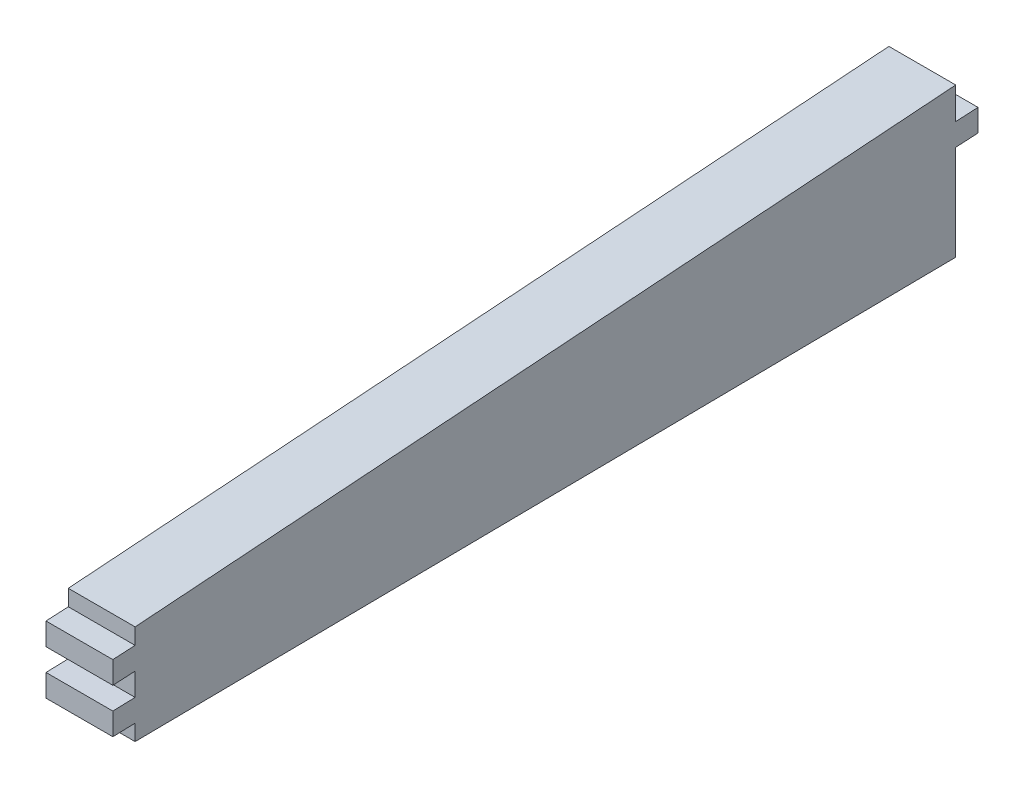
ISO-10303-21;
HEADER;
FILE_DESCRIPTION(('STEP AP214'),'2;1');
FILE_NAME('part.step','',(''),(''),'','','');
FILE_SCHEMA(('AUTOMOTIVE_DESIGN { 1 0 10303 214 1 1 1 1 }'));
ENDSEC;
DATA;
#1=APPLICATION_CONTEXT('core data for automotive mechanical design processes');
#2=APPLICATION_PROTOCOL_DEFINITION('international standard','automotive_design',2000,#1);
#3=PRODUCT_CONTEXT('',#1,'mechanical');
#4=PRODUCT('Part','Part','',(#3));
#5=PRODUCT_RELATED_PRODUCT_CATEGORY('part','',(#4));
#6=PRODUCT_DEFINITION_FORMATION('','',#4);
#7=PRODUCT_DEFINITION_CONTEXT('part definition',#1,'design');
#8=PRODUCT_DEFINITION('design','',#6,#7);
#9=PRODUCT_DEFINITION_SHAPE('','',#8);
#10=(LENGTH_UNIT() NAMED_UNIT(*) SI_UNIT(.MILLI.,.METRE.));
#11=(NAMED_UNIT(*) PLANE_ANGLE_UNIT() SI_UNIT($,.RADIAN.));
#12=(NAMED_UNIT(*) SI_UNIT($,.STERADIAN.) SOLID_ANGLE_UNIT());
#13=UNCERTAINTY_MEASURE_WITH_UNIT(LENGTH_MEASURE(1.E-05),#10,'distance_accuracy_value','');
#14=(GEOMETRIC_REPRESENTATION_CONTEXT(3) GLOBAL_UNCERTAINTY_ASSIGNED_CONTEXT((#13)) GLOBAL_UNIT_ASSIGNED_CONTEXT((#10,
#11,#12)) REPRESENTATION_CONTEXT('',''));
#15=CARTESIAN_POINT('',(0.,0.,0.));
#16=DIRECTION('',(0.,0.,1.));
#17=DIRECTION('',(1.,0.,0.));
#18=AXIS2_PLACEMENT_3D('',#15,#16,#17);
#19=CARTESIAN_POINT('',(243.017706630707,0.,0.));
#20=DIRECTION('',(1.,0.,0.));
#21=DIRECTION('',(0.,0.,-1.));
#22=AXIS2_PLACEMENT_3D('',#19,#20,#21);
#23=PLANE('',#22);
#24=DIRECTION('',(0.,-1.,0.));
#25=VECTOR('',#24,1.);
#26=CARTESIAN_POINT('',(243.017706630707,353.831713156152,1497.60619407791));
#27=LINE('',#26,#25);
#28=CARTESIAN_POINT('',(243.017706630707,356.11488737901,1497.60619407791));
#29=VERTEX_POINT('',#28);
#30=CARTESIAN_POINT('',(243.017706630707,353.831713156152,1497.60619407791));
#31=VERTEX_POINT('',#30);
#32=EDGE_CURVE('E157',#29,#31,#27,.T.);
#33=ORIENTED_EDGE('',*,*,#32,.F.);
#34=DIRECTION('',(0.,0.0302886855912018,-0.999541192510422));
#35=VECTOR('',#34,1.);
#36=CARTESIAN_POINT('',(243.017706630707,356.018676660059,1500.78119407791));
#37=LINE('',#36,#35);
#38=CARTESIAN_POINT('',(243.017706630707,356.018676660059,1500.78119407791));
#39=VERTEX_POINT('',#38);
#40=EDGE_CURVE('E205',#39,#29,#37,.T.);
#41=ORIENTED_EDGE('',*,*,#40,.F.);
#42=DIRECTION('',(0.,-1.,0.));
#43=VECTOR('',#42,1.);
#44=CARTESIAN_POINT('',(243.017706630707,359.193676660059,1500.78119407791));
#45=LINE('',#44,#43);
#46=CARTESIAN_POINT('',(243.017706630707,359.193676660059,1500.78119407791));
#47=VERTEX_POINT('',#46);
#48=EDGE_CURVE('E202',#47,#39,#45,.T.);
#49=ORIENTED_EDGE('',*,*,#48,.F.);
#50=DIRECTION('',(0.,-0.0302886855912018,0.999541192510422));
#51=VECTOR('',#50,1.);
#52=CARTESIAN_POINT('',(243.017706630707,359.28988737901,1497.60619407791));
#53=LINE('',#52,#51);
#54=CARTESIAN_POINT('',(243.017706630707,359.28988737901,1497.60619407791));
#55=VERTEX_POINT('',#54);
#56=EDGE_CURVE('E199',#55,#47,#53,.T.);
#57=ORIENTED_EDGE('',*,*,#56,.F.);
#58=DIRECTION('',(0.,-1.,0.));
#59=VECTOR('',#58,1.);
#60=CARTESIAN_POINT('',(243.017706630707,359.28988737901,1497.60619407791));
#61=LINE('',#60,#59);
#62=CARTESIAN_POINT('',(243.017706630707,362.536267003469,1497.60619407791));
#63=VERTEX_POINT('',#62);
#64=EDGE_CURVE('E196',#63,#55,#61,.T.);
#65=ORIENTED_EDGE('',*,*,#64,.F.);
#66=DIRECTION('',(0.,0.0527109798388548,-0.998609809988079));
#67=VECTOR('',#66,1.);
#68=CARTESIAN_POINT('',(243.017706630707,362.368676660059,1500.78119407791));
#69=LINE('',#68,#67);
#70=CARTESIAN_POINT('',(243.017706630707,362.368676660059,1500.78119407791));
#71=VERTEX_POINT('',#70);
#72=EDGE_CURVE('E193',#71,#63,#69,.T.);
#73=ORIENTED_EDGE('',*,*,#72,.F.);
#74=DIRECTION('',(0.,-1.,0.));
#75=VECTOR('',#74,1.);
#76=CARTESIAN_POINT('',(243.017706630707,365.543676660059,1500.78119407791));
#77=LINE('',#76,#75);
#78=CARTESIAN_POINT('',(243.017706630707,365.543676660059,1500.78119407791));
#79=VERTEX_POINT('',#78);
#80=EDGE_CURVE('E190',#79,#71,#77,.T.);
#81=ORIENTED_EDGE('',*,*,#80,.F.);
#82=DIRECTION('',(0.,-0.0527109798388548,0.998609809988079));
#83=VECTOR('',#82,1.);
#84=CARTESIAN_POINT('',(243.017706630707,365.711267003469,1497.60619407791));
#85=LINE('',#84,#83);
#86=CARTESIAN_POINT('',(243.017706630707,365.711267003469,1497.60619407791));
#87=VERTEX_POINT('',#86);
#88=EDGE_CURVE('E187',#87,#79,#85,.T.);
#89=ORIENTED_EDGE('',*,*,#88,.F.);
#90=DIRECTION('',(0.,-1.,0.));
#91=VECTOR('',#90,1.);
#92=CARTESIAN_POINT('',(243.017706630707,365.711267003469,1497.60619407791));
#93=LINE('',#92,#91);
#94=CARTESIAN_POINT('',(243.017706630707,367.994441226327,1497.60619407791));
#95=VERTEX_POINT('',#94);
#96=EDGE_CURVE('E184',#95,#87,#93,.T.);
#97=ORIENTED_EDGE('',*,*,#96,.F.);
#98=DIRECTION('',(0.,-0.071709265095427,0.997425576822388));
#99=VECTOR('',#98,1.);
#100=CARTESIAN_POINT('',(243.017706630707,367.994441226327,1497.60619407791));
#101=LINE('',#100,#99);
#102=CARTESIAN_POINT('',(243.017706630707,376.402186089953,1380.66036065991));
#103=VERTEX_POINT('',#102);
#104=EDGE_CURVE('E181',#103,#95,#101,.T.);
#105=ORIENTED_EDGE('',*,*,#104,.F.);
#106=DIRECTION('',(0.,1.,0.));
#107=VECTOR('',#106,1.);
#108=CARTESIAN_POINT('',(243.017706630707,376.402186089953,1380.66036065991));
#109=LINE('',#108,#107);
#110=CARTESIAN_POINT('',(243.017706630707,371.884177990206,1380.66036065991));
#111=VERTEX_POINT('',#110);
#112=EDGE_CURVE('E178',#111,#103,#109,.T.);
#113=ORIENTED_EDGE('',*,*,#112,.F.);
#114=DIRECTION('',(0.,-0.0527109798388475,0.99860980998808));
#115=VECTOR('',#114,1.);
#116=CARTESIAN_POINT('',(243.017706630707,372.051768333616,1377.48536065991));
#117=LINE('',#116,#115);
#118=CARTESIAN_POINT('',(243.017706630707,372.051768333616,1377.48536065991));
#119=VERTEX_POINT('',#118);
#120=EDGE_CURVE('E175',#119,#111,#117,.T.);
#121=ORIENTED_EDGE('',*,*,#120,.F.);
#122=DIRECTION('',(0.,1.,0.));
#123=VECTOR('',#122,1.);
#124=CARTESIAN_POINT('',(243.017706630707,368.876768333616,1377.48536065991));
#125=LINE('',#124,#123);
#126=CARTESIAN_POINT('',(243.017706630707,368.876768333616,1377.48536065991));
#127=VERTEX_POINT('',#126);
#128=EDGE_CURVE('E172',#127,#119,#125,.T.);
#129=ORIENTED_EDGE('',*,*,#128,.F.);
#130=DIRECTION('',(0.,0.0527109798388475,-0.99860980998808));
#131=VECTOR('',#130,1.);
#132=CARTESIAN_POINT('',(243.017706630707,368.709177990206,1380.66036065991));
#133=LINE('',#132,#131);
#134=CARTESIAN_POINT('',(243.017706630707,368.709177990206,1380.66036065991));
#135=VERTEX_POINT('',#134);
#136=EDGE_CURVE('E169',#135,#127,#133,.T.);
#137=ORIENTED_EDGE('',*,*,#136,.F.);
#138=DIRECTION('',(0.,1.,0.));
#139=VECTOR('',#138,1.);
#140=CARTESIAN_POINT('',(243.017706630707,355.140640763176,1380.66036065991));
#141=LINE('',#140,#139);
#142=CARTESIAN_POINT('',(243.017706630707,355.140640763176,1380.66036065991));
#143=VERTEX_POINT('',#142);
#144=EDGE_CURVE('E160',#143,#135,#141,.T.);
#145=ORIENTED_EDGE('',*,*,#144,.F.);
#146=DIRECTION('',(0.,0.011191896188366,-0.999937368768519));
#147=VECTOR('',#146,1.);
#148=CARTESIAN_POINT('',(243.017706630707,355.140640763176,1380.66036065991));
#149=LINE('',#148,#147);
#150=EDGE_CURVE('E149',#31,#143,#149,.T.);
#151=ORIENTED_EDGE('',*,*,#150,.F.);
#152=EDGE_LOOP('',(#33,#41,#49,#57,#65,#73,#81,#89,#97,#105,#113,#121,#129,#137,#145,#151));
#153=FACE_BOUND('',#152,.T.);
#154=ADVANCED_FACE('F33',(#153),#23,.F.);
#155=CARTESIAN_POINT('',(377.887386560469,356.018676660059,1500.78119407791));
#156=DIRECTION('',(0.,0.999541192510422,0.0302886855912018));
#157=DIRECTION('',(0.,-0.0302886855912018,0.999541192510422));
#158=AXIS2_PLACEMENT_3D('',#155,#156,#157);
#159=PLANE('',#158);
#160=DIRECTION('',(-1.,0.,0.));
#161=VECTOR('',#160,1.);
#162=CARTESIAN_POINT('',(377.887386560469,356.11488737901,1497.60619407791));
#163=LINE('',#162,#161);
#164=CARTESIAN_POINT('',(252.542706630704,356.11488737901,1497.60619407791));
#165=VERTEX_POINT('',#164);
#166=EDGE_CURVE('E163',#165,#29,#163,.T.);
#167=ORIENTED_EDGE('',*,*,#166,.F.);
#168=DIRECTION('',(0.,-0.0302886855912018,0.999541192510423));
#169=VECTOR('',#168,1.);
#170=CARTESIAN_POINT('',(252.542706630704,356.018676660059,1500.78119407791));
#171=LINE('',#170,#169);
#172=CARTESIAN_POINT('',(252.542706630704,356.018676660059,1500.78119407791));
#173=VERTEX_POINT('',#172);
#174=EDGE_CURVE('E37',#165,#173,#171,.T.);
#175=ORIENTED_EDGE('',*,*,#174,.T.);
#176=DIRECTION('',(-1.,0.,0.));
#177=VECTOR('',#176,1.);
#178=CARTESIAN_POINT('',(377.887386560469,356.018676660059,1500.78119407791));
#179=LINE('',#178,#177);
#180=EDGE_CURVE('E208',#173,#39,#179,.T.);
#181=ORIENTED_EDGE('',*,*,#180,.T.);
#182=ORIENTED_EDGE('',*,*,#40,.T.);
#183=EDGE_LOOP('',(#167,#175,#181,#182));
#184=FACE_BOUND('',#183,.T.);
#185=ADVANCED_FACE('F277',(#184),#159,.F.);
#186=CARTESIAN_POINT('',(377.887386560469,359.193676660059,1500.78119407791));
#187=DIRECTION('',(0.,0.,-1.));
#188=DIRECTION('',(-1.,0.,0.));
#189=AXIS2_PLACEMENT_3D('',#186,#187,#188);
#190=PLANE('',#189);
#191=ORIENTED_EDGE('',*,*,#180,.F.);
#192=DIRECTION('',(0.,1.,0.));
#193=VECTOR('',#192,1.);
#194=CARTESIAN_POINT('',(252.542706630704,359.193676660059,1500.78119407791));
#195=LINE('',#194,#193);
#196=CARTESIAN_POINT('',(252.542706630704,359.193676660059,1500.78119407791));
#197=VERTEX_POINT('',#196);
#198=EDGE_CURVE('E271',#173,#197,#195,.T.);
#199=ORIENTED_EDGE('',*,*,#198,.T.);
#200=DIRECTION('',(-1.,0.,0.));
#201=VECTOR('',#200,1.);
#202=CARTESIAN_POINT('',(377.887386560469,359.193676660059,1500.78119407791));
#203=LINE('',#202,#201);
#204=EDGE_CURVE('E210',#197,#47,#203,.T.);
#205=ORIENTED_EDGE('',*,*,#204,.T.);
#206=ORIENTED_EDGE('',*,*,#48,.T.);
#207=EDGE_LOOP('',(#191,#199,#205,#206));
#208=FACE_BOUND('',#207,.T.);
#209=ADVANCED_FACE('F280',(#208),#190,.F.);
#210=CARTESIAN_POINT('',(377.887386560469,359.28988737901,1497.60619407791));
#211=DIRECTION('',(0.,-0.999541192510422,-0.0302886855912018));
#212=DIRECTION('',(0.,0.0302886855912018,-0.999541192510422));
#213=AXIS2_PLACEMENT_3D('',#210,#211,#212);
#214=PLANE('',#213);
#215=ORIENTED_EDGE('',*,*,#204,.F.);
#216=DIRECTION('',(0.,0.0302886855912018,-0.999541192510423));
#217=VECTOR('',#216,1.);
#218=CARTESIAN_POINT('',(252.542706630704,359.28988737901,1497.60619407791));
#219=LINE('',#218,#217);
#220=CARTESIAN_POINT('',(252.542706630704,359.28988737901,1497.60619407791));
#221=VERTEX_POINT('',#220);
#222=EDGE_CURVE('E268',#197,#221,#219,.T.);
#223=ORIENTED_EDGE('',*,*,#222,.T.);
#224=DIRECTION('',(-1.,0.,0.));
#225=VECTOR('',#224,1.);
#226=CARTESIAN_POINT('',(377.887386560469,359.28988737901,1497.60619407791));
#227=LINE('',#226,#225);
#228=EDGE_CURVE('E212',#221,#55,#227,.T.);
#229=ORIENTED_EDGE('',*,*,#228,.T.);
#230=ORIENTED_EDGE('',*,*,#56,.T.);
#231=EDGE_LOOP('',(#215,#223,#229,#230));
#232=FACE_BOUND('',#231,.T.);
#233=ADVANCED_FACE('F286',(#232),#214,.F.);
#234=CARTESIAN_POINT('',(377.887386560469,359.28988737901,1497.60619407791));
#235=DIRECTION('',(0.,0.,-1.));
#236=DIRECTION('',(0.,1.,0.));
#237=AXIS2_PLACEMENT_3D('',#234,#235,#236);
#238=PLANE('',#237);
#239=ORIENTED_EDGE('',*,*,#228,.F.);
#240=DIRECTION('',(0.,1.,0.));
#241=VECTOR('',#240,1.);
#242=CARTESIAN_POINT('',(252.542706630704,359.28988737901,1497.60619407791));
#243=LINE('',#242,#241);
#244=CARTESIAN_POINT('',(252.542706630704,362.536267003469,1497.60619407791));
#245=VERTEX_POINT('',#244);
#246=EDGE_CURVE('E265',#221,#245,#243,.T.);
#247=ORIENTED_EDGE('',*,*,#246,.T.);
#248=DIRECTION('',(-1.,0.,0.));
#249=VECTOR('',#248,1.);
#250=CARTESIAN_POINT('',(377.887386560469,362.536267003469,1497.60619407791));
#251=LINE('',#250,#249);
#252=EDGE_CURVE('E214',#245,#63,#251,.T.);
#253=ORIENTED_EDGE('',*,*,#252,.T.);
#254=ORIENTED_EDGE('',*,*,#64,.T.);
#255=EDGE_LOOP('',(#239,#247,#253,#254));
#256=FACE_BOUND('',#255,.T.);
#257=ADVANCED_FACE('F289',(#256),#238,.F.);
#258=CARTESIAN_POINT('',(377.887386560469,362.368676660059,1500.78119407791));
#259=DIRECTION('',(0.,0.998609809988079,0.0527109798388548));
#260=DIRECTION('',(0.,-0.0527109798388549,0.998609809988079));
#261=AXIS2_PLACEMENT_3D('',#258,#259,#260);
#262=PLANE('',#261);
#263=ORIENTED_EDGE('',*,*,#252,.F.);
#264=DIRECTION('',(0.,-0.0527109798388549,0.998609809988079));
#265=VECTOR('',#264,1.);
#266=CARTESIAN_POINT('',(252.542706630704,362.368676660059,1500.78119407791));
#267=LINE('',#266,#265);
#268=CARTESIAN_POINT('',(252.542706630704,362.368676660059,1500.78119407791));
#269=VERTEX_POINT('',#268);
#270=EDGE_CURVE('E262',#245,#269,#267,.T.);
#271=ORIENTED_EDGE('',*,*,#270,.T.);
#272=DIRECTION('',(-1.,0.,0.));
#273=VECTOR('',#272,1.);
#274=CARTESIAN_POINT('',(377.887386560469,362.368676660059,1500.78119407791));
#275=LINE('',#274,#273);
#276=EDGE_CURVE('E216',#269,#71,#275,.T.);
#277=ORIENTED_EDGE('',*,*,#276,.T.);
#278=ORIENTED_EDGE('',*,*,#72,.T.);
#279=EDGE_LOOP('',(#263,#271,#277,#278));
#280=FACE_BOUND('',#279,.T.);
#281=ADVANCED_FACE('F292',(#280),#262,.F.);
#282=CARTESIAN_POINT('',(377.887386560469,365.543676660059,1500.78119407791));
#283=DIRECTION('',(0.,0.,-1.));
#284=DIRECTION('',(-1.,0.,0.));
#285=AXIS2_PLACEMENT_3D('',#282,#283,#284);
#286=PLANE('',#285);
#287=ORIENTED_EDGE('',*,*,#276,.F.);
#288=DIRECTION('',(0.,1.,0.));
#289=VECTOR('',#288,1.);
#290=CARTESIAN_POINT('',(252.542706630704,365.543676660059,1500.78119407791));
#291=LINE('',#290,#289);
#292=CARTESIAN_POINT('',(252.542706630704,365.543676660059,1500.78119407791));
#293=VERTEX_POINT('',#292);
#294=EDGE_CURVE('E259',#269,#293,#291,.T.);
#295=ORIENTED_EDGE('',*,*,#294,.T.);
#296=DIRECTION('',(-1.,0.,0.));
#297=VECTOR('',#296,1.);
#298=CARTESIAN_POINT('',(377.887386560469,365.543676660059,1500.78119407791));
#299=LINE('',#298,#297);
#300=EDGE_CURVE('E218',#293,#79,#299,.T.);
#301=ORIENTED_EDGE('',*,*,#300,.T.);
#302=ORIENTED_EDGE('',*,*,#80,.T.);
#303=EDGE_LOOP('',(#287,#295,#301,#302));
#304=FACE_BOUND('',#303,.T.);
#305=ADVANCED_FACE('F298',(#304),#286,.F.);
#306=CARTESIAN_POINT('',(377.887386560469,365.711267003469,1497.60619407791));
#307=DIRECTION('',(0.,-0.998609809988079,-0.0527109798388548));
#308=DIRECTION('',(0.,0.0527109798388549,-0.998609809988079));
#309=AXIS2_PLACEMENT_3D('',#306,#307,#308);
#310=PLANE('',#309);
#311=ORIENTED_EDGE('',*,*,#300,.F.);
#312=DIRECTION('',(0.,0.0527109798388549,-0.998609809988079));
#313=VECTOR('',#312,1.);
#314=CARTESIAN_POINT('',(252.542706630704,365.711267003469,1497.60619407791));
#315=LINE('',#314,#313);
#316=CARTESIAN_POINT('',(252.542706630704,365.711267003469,1497.60619407791));
#317=VERTEX_POINT('',#316);
#318=EDGE_CURVE('E256',#293,#317,#315,.T.);
#319=ORIENTED_EDGE('',*,*,#318,.T.);
#320=DIRECTION('',(-1.,0.,0.));
#321=VECTOR('',#320,1.);
#322=CARTESIAN_POINT('',(377.887386560469,365.711267003469,1497.60619407791));
#323=LINE('',#322,#321);
#324=EDGE_CURVE('E220',#317,#87,#323,.T.);
#325=ORIENTED_EDGE('',*,*,#324,.T.);
#326=ORIENTED_EDGE('',*,*,#88,.T.);
#327=EDGE_LOOP('',(#311,#319,#325,#326));
#328=FACE_BOUND('',#327,.T.);
#329=ADVANCED_FACE('F301',(#328),#310,.F.);
#330=CARTESIAN_POINT('',(377.887386560469,365.711267003469,1497.60619407791));
#331=DIRECTION('',(0.,0.,-1.));
#332=DIRECTION('',(0.,1.,0.));
#333=AXIS2_PLACEMENT_3D('',#330,#331,#332);
#334=PLANE('',#333);
#335=ORIENTED_EDGE('',*,*,#324,.F.);
#336=DIRECTION('',(0.,1.,0.));
#337=VECTOR('',#336,1.);
#338=CARTESIAN_POINT('',(252.542706630704,365.711267003469,1497.60619407791));
#339=LINE('',#338,#337);
#340=CARTESIAN_POINT('',(252.542706630704,367.994441226327,1497.60619407791));
#341=VERTEX_POINT('',#340);
#342=EDGE_CURVE('E253',#317,#341,#339,.T.);
#343=ORIENTED_EDGE('',*,*,#342,.T.);
#344=DIRECTION('',(-1.,0.,0.));
#345=VECTOR('',#344,1.);
#346=CARTESIAN_POINT('',(377.887386560469,367.994441226327,1497.60619407791));
#347=LINE('',#346,#345);
#348=EDGE_CURVE('E222',#341,#95,#347,.T.);
#349=ORIENTED_EDGE('',*,*,#348,.T.);
#350=ORIENTED_EDGE('',*,*,#96,.T.);
#351=EDGE_LOOP('',(#335,#343,#349,#350));
#352=FACE_BOUND('',#351,.T.);
#353=ADVANCED_FACE('F304',(#352),#334,.F.);
#354=CARTESIAN_POINT('',(377.887386560469,367.994441226327,1497.60619407791));
#355=DIRECTION('',(0.,-0.997425576822388,-0.071709265095427));
#356=DIRECTION('',(0.,0.071709265095427,-0.997425576822388));
#357=AXIS2_PLACEMENT_3D('',#354,#355,#356);
#358=PLANE('',#357);
#359=ORIENTED_EDGE('',*,*,#348,.F.);
#360=DIRECTION('',(0.,0.071709265095427,-0.997425576822388));
#361=VECTOR('',#360,1.);
#362=CARTESIAN_POINT('',(252.542706630704,367.994441226327,1497.60619407791));
#363=LINE('',#362,#361);
#364=CARTESIAN_POINT('',(252.542706630704,376.402186089953,1380.66036065991));
#365=VERTEX_POINT('',#364);
#366=EDGE_CURVE('E250',#341,#365,#363,.T.);
#367=ORIENTED_EDGE('',*,*,#366,.T.);
#368=DIRECTION('',(-1.,0.,0.));
#369=VECTOR('',#368,1.);
#370=CARTESIAN_POINT('',(377.887386560469,376.402186089953,1380.66036065991));
#371=LINE('',#370,#369);
#372=EDGE_CURVE('E224',#365,#103,#371,.T.);
#373=ORIENTED_EDGE('',*,*,#372,.T.);
#374=ORIENTED_EDGE('',*,*,#104,.T.);
#375=EDGE_LOOP('',(#359,#367,#373,#374));
#376=FACE_BOUND('',#375,.T.);
#377=ADVANCED_FACE('F310',(#376),#358,.F.);
#378=CARTESIAN_POINT('',(377.887386560469,376.402186089953,1380.66036065991));
#379=DIRECTION('',(0.,0.,1.));
#380=DIRECTION('',(1.,0.,0.));
#381=AXIS2_PLACEMENT_3D('',#378,#379,#380);
#382=PLANE('',#381);
#383=ORIENTED_EDGE('',*,*,#372,.F.);
#384=DIRECTION('',(0.,-1.,0.));
#385=VECTOR('',#384,1.);
#386=CARTESIAN_POINT('',(252.542706630704,376.402186089953,1380.66036065991));
#387=LINE('',#386,#385);
#388=CARTESIAN_POINT('',(252.542706630704,371.884177990206,1380.66036065991));
#389=VERTEX_POINT('',#388);
#390=EDGE_CURVE('E247',#365,#389,#387,.T.);
#391=ORIENTED_EDGE('',*,*,#390,.T.);
#392=DIRECTION('',(-1.,0.,0.));
#393=VECTOR('',#392,1.);
#394=CARTESIAN_POINT('',(377.887386560469,371.884177990206,1380.66036065991));
#395=LINE('',#394,#393);
#396=EDGE_CURVE('E226',#389,#111,#395,.T.);
#397=ORIENTED_EDGE('',*,*,#396,.T.);
#398=ORIENTED_EDGE('',*,*,#112,.T.);
#399=EDGE_LOOP('',(#383,#391,#397,#398));
#400=FACE_BOUND('',#399,.T.);
#401=ADVANCED_FACE('F313',(#400),#382,.F.);
#402=CARTESIAN_POINT('',(377.887386560469,372.051768333616,1377.48536065991));
#403=DIRECTION('',(0.,-0.99860980998808,-0.0527109798388475));
#404=DIRECTION('',(0.,0.0527109798388475,-0.99860980998808));
#405=AXIS2_PLACEMENT_3D('',#402,#403,#404);
#406=PLANE('',#405);
#407=ORIENTED_EDGE('',*,*,#396,.F.);
#408=DIRECTION('',(0.,0.0527109798388475,-0.99860980998808));
#409=VECTOR('',#408,1.);
#410=CARTESIAN_POINT('',(252.542706630704,372.051768333616,1377.48536065991));
#411=LINE('',#410,#409);
#412=CARTESIAN_POINT('',(252.542706630704,372.051768333616,1377.48536065991));
#413=VERTEX_POINT('',#412);
#414=EDGE_CURVE('E244',#389,#413,#411,.T.);
#415=ORIENTED_EDGE('',*,*,#414,.T.);
#416=DIRECTION('',(-1.,0.,0.));
#417=VECTOR('',#416,1.);
#418=CARTESIAN_POINT('',(377.887386560469,372.051768333616,1377.48536065991));
#419=LINE('',#418,#417);
#420=EDGE_CURVE('E228',#413,#119,#419,.T.);
#421=ORIENTED_EDGE('',*,*,#420,.T.);
#422=ORIENTED_EDGE('',*,*,#120,.T.);
#423=EDGE_LOOP('',(#407,#415,#421,#422));
#424=FACE_BOUND('',#423,.T.);
#425=ADVANCED_FACE('F316',(#424),#406,.F.);
#426=CARTESIAN_POINT('',(377.887386560469,368.876768333616,1377.48536065991));
#427=DIRECTION('',(0.,0.,1.));
#428=DIRECTION('',(1.,0.,0.));
#429=AXIS2_PLACEMENT_3D('',#426,#427,#428);
#430=PLANE('',#429);
#431=ORIENTED_EDGE('',*,*,#420,.F.);
#432=DIRECTION('',(0.,-1.,0.));
#433=VECTOR('',#432,1.);
#434=CARTESIAN_POINT('',(252.542706630704,368.876768333616,1377.48536065991));
#435=LINE('',#434,#433);
#436=CARTESIAN_POINT('',(252.542706630704,368.876768333616,1377.48536065991));
#437=VERTEX_POINT('',#436);
#438=EDGE_CURVE('E239',#413,#437,#435,.T.);
#439=ORIENTED_EDGE('',*,*,#438,.T.);
#440=DIRECTION('',(-1.,0.,0.));
#441=VECTOR('',#440,1.);
#442=CARTESIAN_POINT('',(377.887386560469,368.876768333616,1377.48536065991));
#443=LINE('',#442,#441);
#444=EDGE_CURVE('E230',#437,#127,#443,.T.);
#445=ORIENTED_EDGE('',*,*,#444,.T.);
#446=ORIENTED_EDGE('',*,*,#128,.T.);
#447=EDGE_LOOP('',(#431,#439,#445,#446));
#448=FACE_BOUND('',#447,.T.);
#449=ADVANCED_FACE('F320',(#448),#430,.F.);
#450=CARTESIAN_POINT('',(377.887386560469,368.709177990206,1380.66036065991));
#451=DIRECTION('',(0.,0.99860980998808,0.0527109798388475));
#452=DIRECTION('',(0.,-0.0527109798388475,0.99860980998808));
#453=AXIS2_PLACEMENT_3D('',#450,#451,#452);
#454=PLANE('',#453);
#455=ORIENTED_EDGE('',*,*,#444,.F.);
#456=DIRECTION('',(0.,-0.0527109798388475,0.99860980998808));
#457=VECTOR('',#456,1.);
#458=CARTESIAN_POINT('',(252.542706630704,368.709177990206,1380.66036065991));
#459=LINE('',#458,#457);
#460=CARTESIAN_POINT('',(252.542706630704,368.709177990206,1380.66036065991));
#461=VERTEX_POINT('',#460);
#462=EDGE_CURVE('E237',#437,#461,#459,.T.);
#463=ORIENTED_EDGE('',*,*,#462,.T.);
#464=DIRECTION('',(-1.,0.,0.));
#465=VECTOR('',#464,1.);
#466=CARTESIAN_POINT('',(377.887386560469,368.709177990206,1380.66036065991));
#467=LINE('',#466,#465);
#468=EDGE_CURVE('E232',#461,#135,#467,.T.);
#469=ORIENTED_EDGE('',*,*,#468,.T.);
#470=ORIENTED_EDGE('',*,*,#136,.T.);
#471=EDGE_LOOP('',(#455,#463,#469,#470));
#472=FACE_BOUND('',#471,.T.);
#473=ADVANCED_FACE('F323',(#472),#454,.F.);
#474=CARTESIAN_POINT('',(377.887386560469,355.140640763176,1380.66036065991));
#475=DIRECTION('',(0.,0.,1.));
#476=DIRECTION('',(1.,0.,0.));
#477=AXIS2_PLACEMENT_3D('',#474,#475,#476);
#478=PLANE('',#477);
#479=ORIENTED_EDGE('',*,*,#468,.F.);
#480=DIRECTION('',(0.,-1.,0.));
#481=VECTOR('',#480,1.);
#482=CARTESIAN_POINT('',(252.542706630704,355.140640763176,1380.66036065991));
#483=LINE('',#482,#481);
#484=CARTESIAN_POINT('',(252.542706630704,355.140640763176,1380.66036065991));
#485=VERTEX_POINT('',#484);
#486=EDGE_CURVE('E54',#461,#485,#483,.T.);
#487=ORIENTED_EDGE('',*,*,#486,.T.);
#488=DIRECTION('',(-1.,0.,0.));
#489=VECTOR('',#488,1.);
#490=CARTESIAN_POINT('',(377.887386560469,355.140640763176,1380.66036065991));
#491=LINE('',#490,#489);
#492=EDGE_CURVE('E153',#485,#143,#491,.T.);
#493=ORIENTED_EDGE('',*,*,#492,.T.);
#494=ORIENTED_EDGE('',*,*,#144,.T.);
#495=EDGE_LOOP('',(#479,#487,#493,#494));
#496=FACE_BOUND('',#495,.T.);
#497=ADVANCED_FACE('F235',(#496),#478,.F.);
#498=CARTESIAN_POINT('',(377.887386560469,355.140640763176,1380.66036065991));
#499=DIRECTION('',(0.,0.999937368768519,0.011191896188366));
#500=DIRECTION('',(0.,-0.011191896188366,0.999937368768519));
#501=AXIS2_PLACEMENT_3D('',#498,#499,#500);
#502=PLANE('',#501);
#503=ORIENTED_EDGE('',*,*,#492,.F.);
#504=DIRECTION('',(0.,-0.011191896188366,0.999937368768519));
#505=VECTOR('',#504,1.);
#506=CARTESIAN_POINT('',(252.542706630704,355.140640763176,1380.66036065991));
#507=LINE('',#506,#505);
#508=CARTESIAN_POINT('',(252.542706630704,353.831713156152,1497.60619407791));
#509=VERTEX_POINT('',#508);
#510=EDGE_CURVE('E42',#485,#509,#507,.T.);
#511=ORIENTED_EDGE('',*,*,#510,.T.);
#512=DIRECTION('',(-1.,0.,0.));
#513=VECTOR('',#512,1.);
#514=CARTESIAN_POINT('',(377.887386560469,353.831713156152,1497.60619407791));
#515=LINE('',#514,#513);
#516=EDGE_CURVE('E146',#509,#31,#515,.T.);
#517=ORIENTED_EDGE('',*,*,#516,.T.);
#518=ORIENTED_EDGE('',*,*,#150,.T.);
#519=EDGE_LOOP('',(#503,#511,#517,#518));
#520=FACE_BOUND('',#519,.T.);
#521=ADVANCED_FACE('F148',(#520),#502,.F.);
#522=CARTESIAN_POINT('',(377.887386560469,353.831713156152,1497.60619407791));
#523=DIRECTION('',(0.,0.,-1.));
#524=DIRECTION('',(-1.,0.,0.));
#525=AXIS2_PLACEMENT_3D('',#522,#523,#524);
#526=PLANE('',#525);
#527=ORIENTED_EDGE('',*,*,#516,.F.);
#528=DIRECTION('',(0.,1.,0.));
#529=VECTOR('',#528,1.);
#530=CARTESIAN_POINT('',(252.542706630704,353.831713156152,1497.60619407791));
#531=LINE('',#530,#529);
#532=EDGE_CURVE('E11',#509,#165,#531,.T.);
#533=ORIENTED_EDGE('',*,*,#532,.T.);
#534=ORIENTED_EDGE('',*,*,#166,.T.);
#535=ORIENTED_EDGE('',*,*,#32,.T.);
#536=EDGE_LOOP('',(#527,#533,#534,#535));
#537=FACE_BOUND('',#536,.T.);
#538=ADVANCED_FACE('F35',(#537),#526,.F.);
#539=CARTESIAN_POINT('',(252.542706630704,344.834338896103,776.88119407791));
#540=DIRECTION('',(-1.,0.,0.));
#541=DIRECTION('',(0.,0.,1.));
#542=AXIS2_PLACEMENT_3D('',#539,#540,#541);
#543=PLANE('',#542);
#544=ORIENTED_EDGE('',*,*,#510,.F.);
#545=ORIENTED_EDGE('',*,*,#486,.F.);
#546=ORIENTED_EDGE('',*,*,#462,.F.);
#547=ORIENTED_EDGE('',*,*,#438,.F.);
#548=ORIENTED_EDGE('',*,*,#414,.F.);
#549=ORIENTED_EDGE('',*,*,#390,.F.);
#550=ORIENTED_EDGE('',*,*,#366,.F.);
#551=ORIENTED_EDGE('',*,*,#342,.F.);
#552=ORIENTED_EDGE('',*,*,#318,.F.);
#553=ORIENTED_EDGE('',*,*,#294,.F.);
#554=ORIENTED_EDGE('',*,*,#270,.F.);
#555=ORIENTED_EDGE('',*,*,#246,.F.);
#556=ORIENTED_EDGE('',*,*,#222,.F.);
#557=ORIENTED_EDGE('',*,*,#198,.F.);
#558=ORIENTED_EDGE('',*,*,#174,.F.);
#559=ORIENTED_EDGE('',*,*,#532,.F.);
#560=EDGE_LOOP('',(#544,#545,#546,#547,#548,#549,#550,#551,#552,#553,#554,#555,#556,#557,#558,#559));
#561=FACE_BOUND('',#560,.T.);
#562=ADVANCED_FACE('F278',(#561),#543,.F.);
#563=CLOSED_SHELL('',(#154,#185,#209,#233,#257,#281,#305,#329,#353,#377,#401,#425,#449,#473,
#497,#521,#538,#562));
#564=MANIFOLD_SOLID_BREP('B2',#563);
#565=ADVANCED_BREP_SHAPE_REPRESENTATION('',(#18,#564),#14);
#566=SHAPE_DEFINITION_REPRESENTATION(#9,#565);
ENDSEC;
END-ISO-10303-21;
